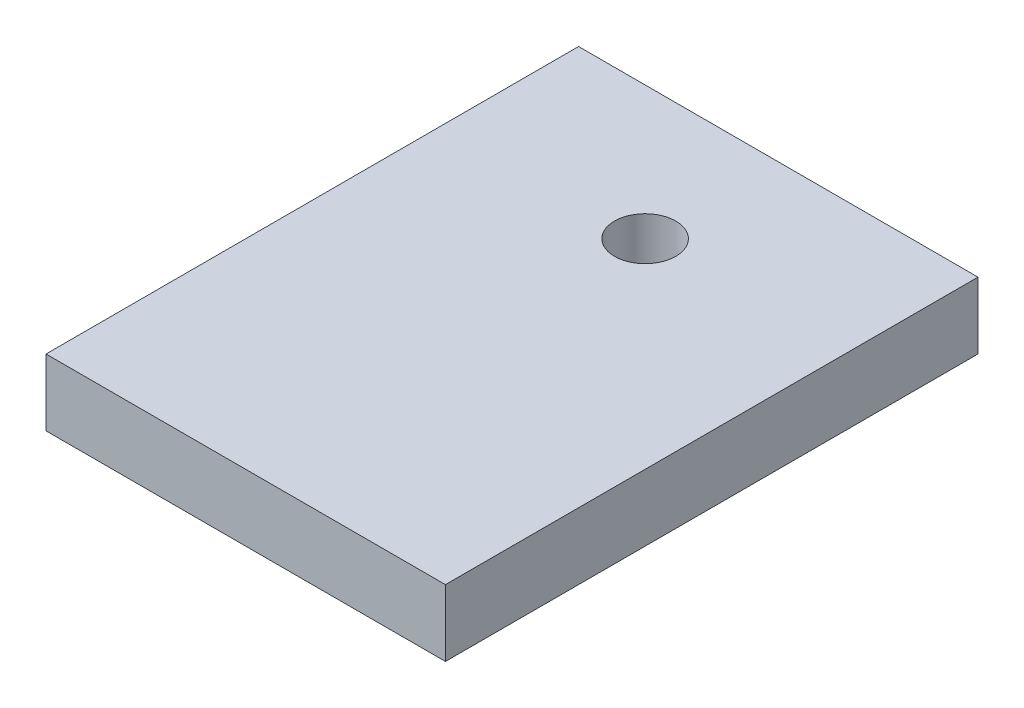
ISO-10303-21;
HEADER;
FILE_DESCRIPTION(('STEP AP214'),'2;1');
FILE_NAME('part.step','',(''),(''),'','','');
FILE_SCHEMA(('AUTOMOTIVE_DESIGN { 1 0 10303 214 1 1 1 1 }'));
ENDSEC;
DATA;
#1=APPLICATION_CONTEXT('core data for automotive mechanical design processes');
#2=APPLICATION_PROTOCOL_DEFINITION('international standard','automotive_design',2000,#1);
#3=PRODUCT_CONTEXT('',#1,'mechanical');
#4=PRODUCT('Part','Part','',(#3));
#5=PRODUCT_RELATED_PRODUCT_CATEGORY('part','',(#4));
#6=PRODUCT_DEFINITION_FORMATION('','',#4);
#7=PRODUCT_DEFINITION_CONTEXT('part definition',#1,'design');
#8=PRODUCT_DEFINITION('design','',#6,#7);
#9=PRODUCT_DEFINITION_SHAPE('','',#8);
#10=(LENGTH_UNIT() NAMED_UNIT(*) SI_UNIT(.MILLI.,.METRE.));
#11=(NAMED_UNIT(*) PLANE_ANGLE_UNIT() SI_UNIT($,.RADIAN.));
#12=(NAMED_UNIT(*) SI_UNIT($,.STERADIAN.) SOLID_ANGLE_UNIT());
#13=UNCERTAINTY_MEASURE_WITH_UNIT(LENGTH_MEASURE(1.E-05),#10,'distance_accuracy_value','');
#14=(GEOMETRIC_REPRESENTATION_CONTEXT(3) GLOBAL_UNCERTAINTY_ASSIGNED_CONTEXT((#13)) GLOBAL_UNIT_ASSIGNED_CONTEXT((#10,
#11,#12)) REPRESENTATION_CONTEXT('',''));
#15=CARTESIAN_POINT('',(0.,0.,0.));
#16=DIRECTION('',(0.,0.,1.));
#17=DIRECTION('',(1.,0.,0.));
#18=AXIS2_PLACEMENT_3D('',#15,#16,#17);
#19=CARTESIAN_POINT('',(0.,3.175,0.));
#20=DIRECTION('',(0.,-1.,0.));
#21=DIRECTION('',(0.,0.,-1.));
#22=AXIS2_PLACEMENT_3D('',#19,#20,#21);
#23=PLANE('',#22);
#24=DIRECTION('',(0.,0.,1.));
#25=VECTOR('',#24,1.);
#26=CARTESIAN_POINT('',(0.,3.175,0.));
#27=LINE('',#26,#25);
#28=CARTESIAN_POINT('',(0.,3.175,-25.4));
#29=VERTEX_POINT('',#28);
#30=CARTESIAN_POINT('',(0.,3.175,0.));
#31=VERTEX_POINT('',#30);
#32=EDGE_CURVE('E91',#29,#31,#27,.T.);
#33=ORIENTED_EDGE('',*,*,#32,.T.);
#34=DIRECTION('',(1.,0.,0.));
#35=VECTOR('',#34,1.);
#36=CARTESIAN_POINT('',(0.,3.175,0.));
#37=LINE('',#36,#35);
#38=CARTESIAN_POINT('',(19.05,3.175,0.));
#39=VERTEX_POINT('',#38);
#40=EDGE_CURVE('E86',#31,#39,#37,.T.);
#41=ORIENTED_EDGE('',*,*,#40,.T.);
#42=DIRECTION('',(0.,0.,-1.));
#43=VECTOR('',#42,1.);
#44=CARTESIAN_POINT('',(19.05,3.175,0.));
#45=LINE('',#44,#43);
#46=CARTESIAN_POINT('',(19.05,3.175,-25.4));
#47=VERTEX_POINT('',#46);
#48=EDGE_CURVE('E89',#39,#47,#45,.T.);
#49=ORIENTED_EDGE('',*,*,#48,.T.);
#50=DIRECTION('',(-1.,0.,0.));
#51=VECTOR('',#50,1.);
#52=CARTESIAN_POINT('',(0.,3.175,-25.4));
#53=LINE('',#52,#51);
#54=EDGE_CURVE('E56',#47,#29,#53,.T.);
#55=ORIENTED_EDGE('',*,*,#54,.T.);
#56=EDGE_LOOP('',(#33,#41,#49,#55));
#57=FACE_BOUND('',#56,.T.);
#58=CARTESIAN_POINT('',(9.525,3.175,-19.05));
#59=DIRECTION('',(0.,1.,0.));
#60=DIRECTION('',(0.,0.,1.));
#61=AXIS2_PLACEMENT_3D('',#58,#59,#60);
#62=CIRCLE('',#61,1.4605);
#63=CARTESIAN_POINT('',(9.525,3.175,-17.5895));
#64=VERTEX_POINT('',#63);
#65=EDGE_CURVE('E106',#64,#64,#62,.T.);
#66=ORIENTED_EDGE('',*,*,#65,.F.);
#67=EDGE_LOOP('',(#66));
#68=FACE_BOUND('',#67,.T.);
#69=ADVANCED_FACE('F39',(#57,#68),#23,.F.);
#70=CARTESIAN_POINT('',(0.,0.,0.));
#71=DIRECTION('',(0.,-1.,0.));
#72=DIRECTION('',(0.,0.,-1.));
#73=AXIS2_PLACEMENT_3D('',#70,#71,#72);
#74=PLANE('',#73);
#75=DIRECTION('',(0.,0.,1.));
#76=VECTOR('',#75,1.);
#77=CARTESIAN_POINT('',(0.,0.,0.));
#78=LINE('',#77,#76);
#79=CARTESIAN_POINT('',(0.,0.,-25.4));
#80=VERTEX_POINT('',#79);
#81=CARTESIAN_POINT('',(0.,0.,0.));
#82=VERTEX_POINT('',#81);
#83=EDGE_CURVE('E103',#80,#82,#78,.T.);
#84=ORIENTED_EDGE('',*,*,#83,.F.);
#85=DIRECTION('',(-1.,0.,0.));
#86=VECTOR('',#85,1.);
#87=CARTESIAN_POINT('',(0.,0.,-25.4));
#88=LINE('',#87,#86);
#89=CARTESIAN_POINT('',(19.05,0.,-25.4));
#90=VERTEX_POINT('',#89);
#91=EDGE_CURVE('E79',#90,#80,#88,.T.);
#92=ORIENTED_EDGE('',*,*,#91,.F.);
#93=DIRECTION('',(0.,0.,-1.));
#94=VECTOR('',#93,1.);
#95=CARTESIAN_POINT('',(19.05,0.,0.));
#96=LINE('',#95,#94);
#97=CARTESIAN_POINT('',(19.05,0.,0.));
#98=VERTEX_POINT('',#97);
#99=EDGE_CURVE('E73',#98,#90,#96,.T.);
#100=ORIENTED_EDGE('',*,*,#99,.F.);
#101=DIRECTION('',(1.,0.,0.));
#102=VECTOR('',#101,1.);
#103=CARTESIAN_POINT('',(0.,0.,0.));
#104=LINE('',#103,#102);
#105=EDGE_CURVE('E95',#82,#98,#104,.T.);
#106=ORIENTED_EDGE('',*,*,#105,.F.);
#107=EDGE_LOOP('',(#84,#92,#100,#106));
#108=FACE_BOUND('',#107,.T.);
#109=CARTESIAN_POINT('',(9.525,0.,-19.05));
#110=DIRECTION('',(0.,1.,0.));
#111=DIRECTION('',(0.,0.,1.));
#112=AXIS2_PLACEMENT_3D('',#109,#110,#111);
#113=CIRCLE('',#112,1.4605);
#114=CARTESIAN_POINT('',(9.525,0.,-17.5895));
#115=VERTEX_POINT('',#114);
#116=EDGE_CURVE('E118',#115,#115,#113,.T.);
#117=ORIENTED_EDGE('',*,*,#116,.T.);
#118=EDGE_LOOP('',(#117));
#119=FACE_BOUND('',#118,.T.);
#120=ADVANCED_FACE('F114',(#108,#119),#74,.T.);
#121=CARTESIAN_POINT('',(0.,3.175,0.));
#122=DIRECTION('',(1.,0.,0.));
#123=DIRECTION('',(0.,0.,-1.));
#124=AXIS2_PLACEMENT_3D('',#121,#122,#123);
#125=PLANE('',#124);
#126=ORIENTED_EDGE('',*,*,#83,.T.);
#127=DIRECTION('',(0.,-1.,0.));
#128=VECTOR('',#127,1.);
#129=CARTESIAN_POINT('',(0.,3.175,0.));
#130=LINE('',#129,#128);
#131=EDGE_CURVE('E11',#31,#82,#130,.T.);
#132=ORIENTED_EDGE('',*,*,#131,.F.);
#133=ORIENTED_EDGE('',*,*,#32,.F.);
#134=DIRECTION('',(0.,-1.,0.));
#135=VECTOR('',#134,1.);
#136=CARTESIAN_POINT('',(0.,3.175,-25.4));
#137=LINE('',#136,#135);
#138=EDGE_CURVE('E99',#29,#80,#137,.T.);
#139=ORIENTED_EDGE('',*,*,#138,.T.);
#140=EDGE_LOOP('',(#126,#132,#133,#139));
#141=FACE_BOUND('',#140,.T.);
#142=ADVANCED_FACE('F41',(#141),#125,.F.);
#143=CARTESIAN_POINT('',(0.,3.175,0.));
#144=DIRECTION('',(0.,0.,-1.));
#145=DIRECTION('',(-1.,0.,0.));
#146=AXIS2_PLACEMENT_3D('',#143,#144,#145);
#147=PLANE('',#146);
#148=ORIENTED_EDGE('',*,*,#105,.T.);
#149=DIRECTION('',(0.,-1.,0.));
#150=VECTOR('',#149,1.);
#151=CARTESIAN_POINT('',(19.05,3.175,0.));
#152=LINE('',#151,#150);
#153=EDGE_CURVE('E48',#39,#98,#152,.T.);
#154=ORIENTED_EDGE('',*,*,#153,.F.);
#155=ORIENTED_EDGE('',*,*,#40,.F.);
#156=ORIENTED_EDGE('',*,*,#131,.T.);
#157=EDGE_LOOP('',(#148,#154,#155,#156));
#158=FACE_BOUND('',#157,.T.);
#159=ADVANCED_FACE('F94',(#158),#147,.F.);
#160=CARTESIAN_POINT('',(19.05,3.175,0.));
#161=DIRECTION('',(-1.,0.,0.));
#162=DIRECTION('',(0.,0.,1.));
#163=AXIS2_PLACEMENT_3D('',#160,#161,#162);
#164=PLANE('',#163);
#165=ORIENTED_EDGE('',*,*,#99,.T.);
#166=DIRECTION('',(0.,-1.,0.));
#167=VECTOR('',#166,1.);
#168=CARTESIAN_POINT('',(19.05,3.175,-25.4));
#169=LINE('',#168,#167);
#170=EDGE_CURVE('E96',#47,#90,#169,.T.);
#171=ORIENTED_EDGE('',*,*,#170,.F.);
#172=ORIENTED_EDGE('',*,*,#48,.F.);
#173=ORIENTED_EDGE('',*,*,#153,.T.);
#174=EDGE_LOOP('',(#165,#171,#172,#173));
#175=FACE_BOUND('',#174,.T.);
#176=ADVANCED_FACE('F97',(#175),#164,.F.);
#177=CARTESIAN_POINT('',(0.,3.175,-25.4));
#178=DIRECTION('',(0.,0.,1.));
#179=DIRECTION('',(1.,0.,0.));
#180=AXIS2_PLACEMENT_3D('',#177,#178,#179);
#181=PLANE('',#180);
#182=ORIENTED_EDGE('',*,*,#91,.T.);
#183=ORIENTED_EDGE('',*,*,#138,.F.);
#184=ORIENTED_EDGE('',*,*,#54,.F.);
#185=ORIENTED_EDGE('',*,*,#170,.T.);
#186=EDGE_LOOP('',(#182,#183,#184,#185));
#187=FACE_BOUND('',#186,.T.);
#188=ADVANCED_FACE('F111',(#187),#181,.F.);
#189=CARTESIAN_POINT('',(9.525,3.175,-19.05));
#190=DIRECTION('',(0.,-1.,0.));
#191=DIRECTION('',(0.,0.,-1.));
#192=AXIS2_PLACEMENT_3D('',#189,#190,#191);
#193=CYLINDRICAL_SURFACE('',#192,1.4605);
#194=ORIENTED_EDGE('',*,*,#65,.T.);
#195=EDGE_LOOP('',(#194));
#196=FACE_BOUND('',#195,.T.);
#197=ORIENTED_EDGE('',*,*,#116,.F.);
#198=EDGE_LOOP('',(#197));
#199=FACE_BOUND('',#198,.T.);
#200=ADVANCED_FACE('F124',(#196,#199),#193,.F.);
#201=CLOSED_SHELL('',(#69,#120,#142,#159,#176,#188,#200));
#202=MANIFOLD_SOLID_BREP('B2',#201);
#203=ADVANCED_BREP_SHAPE_REPRESENTATION('',(#18,#202),#14);
#204=SHAPE_DEFINITION_REPRESENTATION(#9,#203);
ENDSEC;
END-ISO-10303-21;
